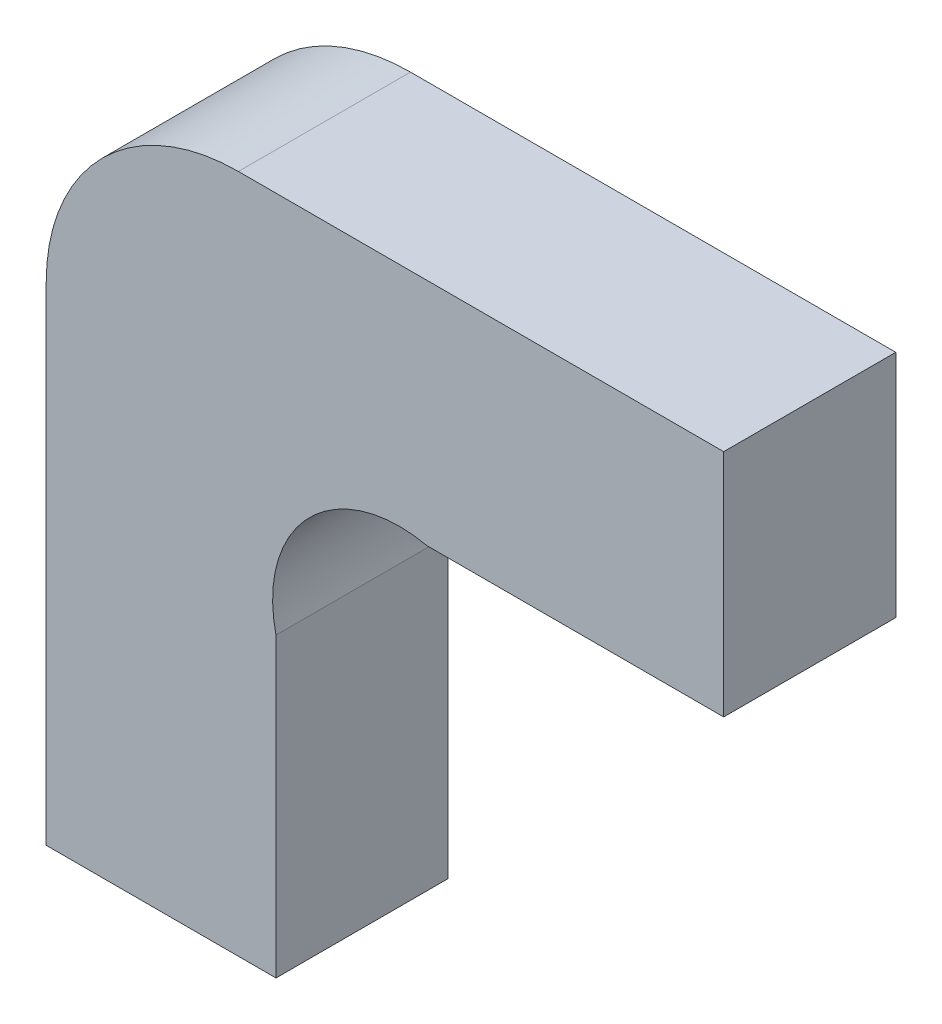
ISO-10303-21;
HEADER;
FILE_DESCRIPTION(('STEP AP214'),'2;1');
FILE_NAME('part.step','',(''),(''),'','','');
FILE_SCHEMA(('AUTOMOTIVE_DESIGN { 1 0 10303 214 1 1 1 1 }'));
ENDSEC;
DATA;
#1=APPLICATION_CONTEXT('core data for automotive mechanical design processes');
#2=APPLICATION_PROTOCOL_DEFINITION('international standard','automotive_design',2000,#1);
#3=PRODUCT_CONTEXT('',#1,'mechanical');
#4=PRODUCT('Part','Part','',(#3));
#5=PRODUCT_RELATED_PRODUCT_CATEGORY('part','',(#4));
#6=PRODUCT_DEFINITION_FORMATION('','',#4);
#7=PRODUCT_DEFINITION_CONTEXT('part definition',#1,'design');
#8=PRODUCT_DEFINITION('design','',#6,#7);
#9=PRODUCT_DEFINITION_SHAPE('','',#8);
#10=(LENGTH_UNIT() NAMED_UNIT(*) SI_UNIT(.MILLI.,.METRE.));
#11=(NAMED_UNIT(*) PLANE_ANGLE_UNIT() SI_UNIT($,.RADIAN.));
#12=(NAMED_UNIT(*) SI_UNIT($,.STERADIAN.) SOLID_ANGLE_UNIT());
#13=UNCERTAINTY_MEASURE_WITH_UNIT(LENGTH_MEASURE(1.E-05),#10,'distance_accuracy_value','');
#14=(GEOMETRIC_REPRESENTATION_CONTEXT(3) GLOBAL_UNCERTAINTY_ASSIGNED_CONTEXT((#13)) GLOBAL_UNIT_ASSIGNED_CONTEXT((#10,
#11,#12)) REPRESENTATION_CONTEXT('',''));
#15=CARTESIAN_POINT('',(0.,0.,0.));
#16=DIRECTION('',(0.,0.,1.));
#17=DIRECTION('',(1.,0.,0.));
#18=AXIS2_PLACEMENT_3D('',#15,#16,#17);
#19=CARTESIAN_POINT('',(0.,44.8118550929166,43.942));
#20=DIRECTION('',(0.,1.,0.));
#21=DIRECTION('',(0.,0.,1.));
#22=AXIS2_PLACEMENT_3D('',#19,#20,#21);
#23=PLANE('',#22);
#24=DIRECTION('',(1.,0.,0.));
#25=VECTOR('',#24,1.);
#26=CARTESIAN_POINT('',(0.,44.8118550929166,0.));
#27=LINE('',#26,#25);
#28=CARTESIAN_POINT('',(0.,44.8118550929166,0.));
#29=VERTEX_POINT('',#28);
#30=CARTESIAN_POINT('',(75.7922991633677,44.8118550929166,0.));
#31=VERTEX_POINT('',#30);
#32=EDGE_CURVE('E129',#29,#31,#27,.T.);
#33=ORIENTED_EDGE('',*,*,#32,.T.);
#34=DIRECTION('',(0.,0.,-1.));
#35=VECTOR('',#34,1.);
#36=CARTESIAN_POINT('',(75.7922991633677,44.8118550929166,43.942));
#37=LINE('',#36,#35);
#38=CARTESIAN_POINT('',(75.7922991633677,44.8118550929166,43.942));
#39=VERTEX_POINT('',#38);
#40=EDGE_CURVE('E11',#39,#31,#37,.T.);
#41=ORIENTED_EDGE('',*,*,#40,.F.);
#42=DIRECTION('',(1.,0.,0.));
#43=VECTOR('',#42,1.);
#44=CARTESIAN_POINT('',(0.,44.8118550929166,43.942));
#45=LINE('',#44,#43);
#46=CARTESIAN_POINT('',(0.,44.8118550929166,43.942));
#47=VERTEX_POINT('',#46);
#48=EDGE_CURVE('E143',#47,#39,#45,.T.);
#49=ORIENTED_EDGE('',*,*,#48,.F.);
#50=DIRECTION('',(0.,0.,-1.));
#51=VECTOR('',#50,1.);
#52=CARTESIAN_POINT('',(0.,44.8118550929166,43.942));
#53=LINE('',#52,#51);
#54=EDGE_CURVE('E125',#47,#29,#53,.T.);
#55=ORIENTED_EDGE('',*,*,#54,.T.);
#56=EDGE_LOOP('',(#33,#41,#49,#55));
#57=FACE_BOUND('',#56,.T.);
#58=ADVANCED_FACE('F33',(#57),#23,.F.);
#59=CARTESIAN_POINT('',(75.7922991633677,103.485855092917,43.942));
#60=DIRECTION('',(-1.,0.,0.));
#61=DIRECTION('',(0.,0.,1.));
#62=AXIS2_PLACEMENT_3D('',#59,#60,#61);
#63=PLANE('',#62);
#64=DIRECTION('',(0.,1.,0.));
#65=VECTOR('',#64,1.);
#66=CARTESIAN_POINT('',(75.7922991633677,103.485855092917,0.));
#67=LINE('',#66,#65);
#68=CARTESIAN_POINT('',(75.7922991633677,103.485855092917,0.));
#69=VERTEX_POINT('',#68);
#70=EDGE_CURVE('E132',#31,#69,#67,.T.);
#71=ORIENTED_EDGE('',*,*,#70,.T.);
#72=DIRECTION('',(0.,0.,-1.));
#73=VECTOR('',#72,1.);
#74=CARTESIAN_POINT('',(75.7922991633677,103.485855092917,43.942));
#75=LINE('',#74,#73);
#76=CARTESIAN_POINT('',(75.7922991633677,103.485855092917,43.942));
#77=VERTEX_POINT('',#76);
#78=EDGE_CURVE('E41',#77,#69,#75,.T.);
#79=ORIENTED_EDGE('',*,*,#78,.F.);
#80=DIRECTION('',(0.,1.,0.));
#81=VECTOR('',#80,1.);
#82=CARTESIAN_POINT('',(75.7922991633677,103.485855092917,43.942));
#83=LINE('',#82,#81);
#84=EDGE_CURVE('E92',#39,#77,#83,.T.);
#85=ORIENTED_EDGE('',*,*,#84,.F.);
#86=ORIENTED_EDGE('',*,*,#40,.T.);
#87=EDGE_LOOP('',(#71,#79,#85,#86));
#88=FACE_BOUND('',#87,.T.);
#89=ADVANCED_FACE('F178',(#88),#63,.F.);
#90=CARTESIAN_POINT('',(-48.1232680660139,103.485855092917,43.942));
#91=DIRECTION('',(0.,-1.,0.));
#92=DIRECTION('',(0.,0.,-1.));
#93=AXIS2_PLACEMENT_3D('',#90,#91,#92);
#94=PLANE('',#93);
#95=DIRECTION('',(-1.,0.,0.));
#96=VECTOR('',#95,1.);
#97=CARTESIAN_POINT('',(-48.1232680660139,103.485855092917,0.));
#98=LINE('',#97,#96);
#99=CARTESIAN_POINT('',(-48.1232680660139,103.485855092917,0.));
#100=VERTEX_POINT('',#99);
#101=EDGE_CURVE('E134',#69,#100,#98,.T.);
#102=ORIENTED_EDGE('',*,*,#101,.T.);
#103=DIRECTION('',(0.,0.,-1.));
#104=VECTOR('',#103,1.);
#105=CARTESIAN_POINT('',(-48.1232680660139,103.485855092917,43.942));
#106=LINE('',#105,#104);
#107=CARTESIAN_POINT('',(-48.1232680660139,103.485855092917,43.942));
#108=VERTEX_POINT('',#107);
#109=EDGE_CURVE('E150',#108,#100,#106,.T.);
#110=ORIENTED_EDGE('',*,*,#109,.F.);
#111=DIRECTION('',(-1.,0.,0.));
#112=VECTOR('',#111,1.);
#113=CARTESIAN_POINT('',(-48.1232680660139,103.485855092917,43.942));
#114=LINE('',#113,#112);
#115=EDGE_CURVE('E158',#77,#108,#114,.T.);
#116=ORIENTED_EDGE('',*,*,#115,.F.);
#117=ORIENTED_EDGE('',*,*,#78,.T.);
#118=EDGE_LOOP('',(#102,#110,#116,#117));
#119=FACE_BOUND('',#118,.T.);
#120=ADVANCED_FACE('F156',(#119),#94,.F.);
#121=CARTESIAN_POINT('',(-48.1232680660139,54.4139731234461,43.942));
#122=DIRECTION('',(0.,0.,-1.));
#123=DIRECTION('',(-1.,0.,0.));
#124=AXIS2_PLACEMENT_3D('',#121,#122,#123);
#125=CYLINDRICAL_SURFACE('',#124,49.0718819694706);
#126=CARTESIAN_POINT('',(-48.1232680660139,54.4139731234461,0.));
#127=DIRECTION('',(0.,0.,1.));
#128=DIRECTION('',(1.,0.,0.));
#129=AXIS2_PLACEMENT_3D('',#126,#127,#128);
#130=CIRCLE('',#129,49.0718819694706);
#131=CARTESIAN_POINT('',(-97.1951500354845,54.4139731234461,0.));
#132=VERTEX_POINT('',#131);
#133=EDGE_CURVE('E136',#100,#132,#130,.T.);
#134=ORIENTED_EDGE('',*,*,#133,.T.);
#135=DIRECTION('',(0.,0.,-1.));
#136=VECTOR('',#135,1.);
#137=CARTESIAN_POINT('',(-97.1951500354845,54.4139731234461,43.942));
#138=LINE('',#137,#136);
#139=CARTESIAN_POINT('',(-97.1951500354845,54.4139731234461,43.942));
#140=VERTEX_POINT('',#139);
#141=EDGE_CURVE('E147',#140,#132,#138,.T.);
#142=ORIENTED_EDGE('',*,*,#141,.F.);
#143=CARTESIAN_POINT('',(-48.1232680660139,54.4139731234461,43.942));
#144=DIRECTION('',(0.,0.,1.));
#145=DIRECTION('',(1.,0.,0.));
#146=AXIS2_PLACEMENT_3D('',#143,#144,#145);
#147=CIRCLE('',#146,49.0718819694706);
#148=EDGE_CURVE('E170',#108,#140,#147,.T.);
#149=ORIENTED_EDGE('',*,*,#148,.F.);
#150=ORIENTED_EDGE('',*,*,#109,.T.);
#151=EDGE_LOOP('',(#134,#142,#149,#150));
#152=FACE_BOUND('',#151,.T.);
#153=ADVANCED_FACE('F166',(#152),#125,.T.);
#154=CARTESIAN_POINT('',(-97.1951500354845,54.413973123446,43.942));
#155=DIRECTION('',(1.,0.,0.));
#156=DIRECTION('',(0.,1.,0.));
#157=AXIS2_PLACEMENT_3D('',#154,#155,#156);
#158=PLANE('',#157);
#159=DIRECTION('',(0.,-1.,0.));
#160=VECTOR('',#159,1.);
#161=CARTESIAN_POINT('',(-97.1951500354845,54.413973123446,0.));
#162=LINE('',#161,#160);
#163=CARTESIAN_POINT('',(-97.1951500354844,-70.0657145157318,0.));
#164=VERTEX_POINT('',#163);
#165=EDGE_CURVE('E138',#132,#164,#162,.T.);
#166=ORIENTED_EDGE('',*,*,#165,.T.);
#167=DIRECTION('',(0.,0.,-1.));
#168=VECTOR('',#167,1.);
#169=CARTESIAN_POINT('',(-97.1951500354844,-70.0657145157318,43.942));
#170=LINE('',#169,#168);
#171=CARTESIAN_POINT('',(-97.1951500354844,-70.0657145157318,43.942));
#172=VERTEX_POINT('',#171);
#173=EDGE_CURVE('E120',#172,#164,#170,.T.);
#174=ORIENTED_EDGE('',*,*,#173,.F.);
#175=DIRECTION('',(0.,-1.,0.));
#176=VECTOR('',#175,1.);
#177=CARTESIAN_POINT('',(-97.1951500354845,54.413973123446,43.942));
#178=LINE('',#177,#176);
#179=EDGE_CURVE('E111',#140,#172,#178,.T.);
#180=ORIENTED_EDGE('',*,*,#179,.F.);
#181=ORIENTED_EDGE('',*,*,#141,.T.);
#182=EDGE_LOOP('',(#166,#174,#180,#181));
#183=FACE_BOUND('',#182,.T.);
#184=ADVANCED_FACE('F169',(#183),#158,.F.);
#185=CARTESIAN_POINT('',(-97.1951500354844,-70.0657145157318,43.942));
#186=DIRECTION('',(0.,1.,0.));
#187=DIRECTION('',(0.,0.,1.));
#188=AXIS2_PLACEMENT_3D('',#185,#186,#187);
#189=PLANE('',#188);
#190=DIRECTION('',(1.,0.,0.));
#191=VECTOR('',#190,1.);
#192=CARTESIAN_POINT('',(-97.1951500354844,-70.0657145157318,0.));
#193=LINE('',#192,#191);
#194=CARTESIAN_POINT('',(-38.5211500354844,-70.0657145157318,0.));
#195=VERTEX_POINT('',#194);
#196=EDGE_CURVE('E119',#164,#195,#193,.T.);
#197=ORIENTED_EDGE('',*,*,#196,.T.);
#198=DIRECTION('',(0.,0.,-1.));
#199=VECTOR('',#198,1.);
#200=CARTESIAN_POINT('',(-38.5211500354844,-70.0657145157318,43.942));
#201=LINE('',#200,#199);
#202=CARTESIAN_POINT('',(-38.5211500354844,-70.0657145157318,43.942));
#203=VERTEX_POINT('',#202);
#204=EDGE_CURVE('E116',#203,#195,#201,.T.);
#205=ORIENTED_EDGE('',*,*,#204,.F.);
#206=DIRECTION('',(1.,0.,0.));
#207=VECTOR('',#206,1.);
#208=CARTESIAN_POINT('',(-97.1951500354844,-70.0657145157318,43.942));
#209=LINE('',#208,#207);
#210=EDGE_CURVE('E105',#172,#203,#209,.T.);
#211=ORIENTED_EDGE('',*,*,#210,.F.);
#212=ORIENTED_EDGE('',*,*,#173,.T.);
#213=EDGE_LOOP('',(#197,#205,#211,#212));
#214=FACE_BOUND('',#213,.T.);
#215=ADVANCED_FACE('F117',(#214),#189,.F.);
#216=CARTESIAN_POINT('',(-38.5211500354844,-70.0657145157318,43.942));
#217=DIRECTION('',(-1.,0.,0.));
#218=DIRECTION('',(0.,0.,1.));
#219=AXIS2_PLACEMENT_3D('',#216,#217,#218);
#220=PLANE('',#219);
#221=DIRECTION('',(0.,1.,0.));
#222=VECTOR('',#221,1.);
#223=CARTESIAN_POINT('',(-38.5211500354844,-70.0657145157318,0.));
#224=LINE('',#223,#222);
#225=CARTESIAN_POINT('',(-38.5211500354844,5.7736629320857,0.));
#226=VERTEX_POINT('',#225);
#227=EDGE_CURVE('E78',#195,#226,#224,.T.);
#228=ORIENTED_EDGE('',*,*,#227,.T.);
#229=DIRECTION('',(0.,0.,-1.));
#230=VECTOR('',#229,1.);
#231=CARTESIAN_POINT('',(-38.5211500354844,5.7736629320857,43.942));
#232=LINE('',#231,#230);
#233=CARTESIAN_POINT('',(-38.5211500354844,5.7736629320857,43.942));
#234=VERTEX_POINT('',#233);
#235=EDGE_CURVE('E121',#234,#226,#232,.T.);
#236=ORIENTED_EDGE('',*,*,#235,.F.);
#237=DIRECTION('',(0.,1.,0.));
#238=VECTOR('',#237,1.);
#239=CARTESIAN_POINT('',(-38.5211500354844,-70.0657145157318,43.942));
#240=LINE('',#239,#238);
#241=EDGE_CURVE('E109',#203,#234,#240,.T.);
#242=ORIENTED_EDGE('',*,*,#241,.F.);
#243=ORIENTED_EDGE('',*,*,#204,.T.);
#244=EDGE_LOOP('',(#228,#236,#242,#243));
#245=FACE_BOUND('',#244,.T.);
#246=ADVANCED_FACE('F123',(#245),#220,.F.);
#247=CARTESIAN_POINT('',(-7.02166658874,13.2159490536325,43.942));
#248=DIRECTION('',(0.,0.,-1.));
#249=DIRECTION('',(-1.,0.,0.));
#250=AXIS2_PLACEMENT_3D('',#247,#248,#249);
#251=CYLINDRICAL_SURFACE('',#250,32.3667279799286);
#252=CARTESIAN_POINT('',(-7.02166658874,13.2159490536325,0.));
#253=DIRECTION('',(0.,0.,-1.));
#254=DIRECTION('',(-1.,0.,0.));
#255=AXIS2_PLACEMENT_3D('',#252,#253,#254);
#256=CIRCLE('',#255,32.3667279799286);
#257=EDGE_CURVE('E84',#226,#29,#256,.T.);
#258=ORIENTED_EDGE('',*,*,#257,.T.);
#259=ORIENTED_EDGE('',*,*,#54,.F.);
#260=CARTESIAN_POINT('',(-7.02166658874,13.2159490536325,43.942));
#261=DIRECTION('',(0.,0.,-1.));
#262=DIRECTION('',(-1.,0.,0.));
#263=AXIS2_PLACEMENT_3D('',#260,#261,#262);
#264=CIRCLE('',#263,32.3667279799286);
#265=EDGE_CURVE('E49',#234,#47,#264,.T.);
#266=ORIENTED_EDGE('',*,*,#265,.F.);
#267=ORIENTED_EDGE('',*,*,#235,.T.);
#268=EDGE_LOOP('',(#258,#259,#266,#267));
#269=FACE_BOUND('',#268,.T.);
#270=ADVANCED_FACE('F194',(#269),#251,.F.);
#271=CARTESIAN_POINT('',(-48.1232680660139,54.4139731234461,43.942));
#272=DIRECTION('',(0.,0.,1.));
#273=DIRECTION('',(1.,0.,0.));
#274=AXIS2_PLACEMENT_3D('',#271,#272,#273);
#275=PLANE('',#274);
#276=ORIENTED_EDGE('',*,*,#48,.T.);
#277=ORIENTED_EDGE('',*,*,#84,.T.);
#278=ORIENTED_EDGE('',*,*,#115,.T.);
#279=ORIENTED_EDGE('',*,*,#148,.T.);
#280=ORIENTED_EDGE('',*,*,#179,.T.);
#281=ORIENTED_EDGE('',*,*,#210,.T.);
#282=ORIENTED_EDGE('',*,*,#241,.T.);
#283=ORIENTED_EDGE('',*,*,#265,.T.);
#284=EDGE_LOOP('',(#276,#277,#278,#279,#280,#281,#282,#283));
#285=FACE_BOUND('',#284,.T.);
#286=ADVANCED_FACE('F107',(#285),#275,.T.);
#287=CARTESIAN_POINT('',(-48.1232680660139,54.4139731234461,0.));
#288=DIRECTION('',(0.,0.,1.));
#289=DIRECTION('',(1.,0.,0.));
#290=AXIS2_PLACEMENT_3D('',#287,#288,#289);
#291=PLANE('',#290);
#292=ORIENTED_EDGE('',*,*,#32,.F.);
#293=ORIENTED_EDGE('',*,*,#257,.F.);
#294=ORIENTED_EDGE('',*,*,#227,.F.);
#295=ORIENTED_EDGE('',*,*,#196,.F.);
#296=ORIENTED_EDGE('',*,*,#165,.F.);
#297=ORIENTED_EDGE('',*,*,#133,.F.);
#298=ORIENTED_EDGE('',*,*,#101,.F.);
#299=ORIENTED_EDGE('',*,*,#70,.F.);
#300=EDGE_LOOP('',(#292,#293,#294,#295,#296,#297,#298,#299));
#301=FACE_BOUND('',#300,.T.);
#302=ADVANCED_FACE('F162',(#301),#291,.F.);
#303=CLOSED_SHELL('',(#58,#89,#120,#153,#184,#215,#246,#270,#286,#302));
#304=MANIFOLD_SOLID_BREP('B2',#303);
#305=ADVANCED_BREP_SHAPE_REPRESENTATION('',(#18,#304),#14);
#306=SHAPE_DEFINITION_REPRESENTATION(#9,#305);
ENDSEC;
END-ISO-10303-21;
